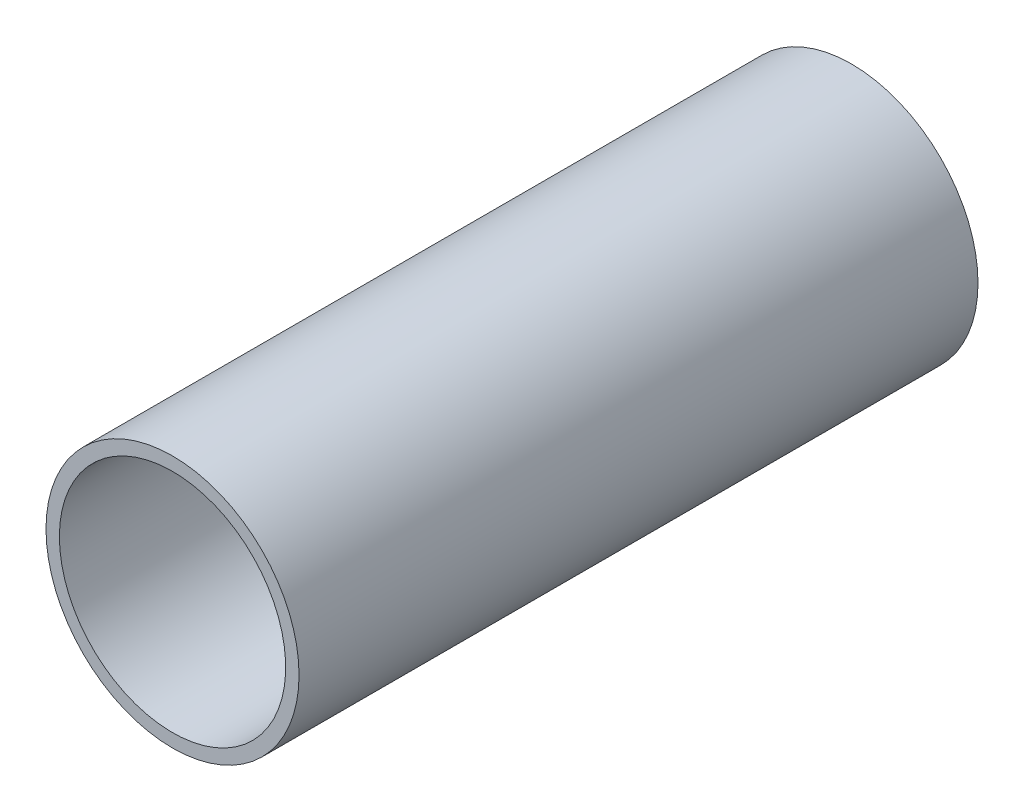
ISO-10303-21;
HEADER;
FILE_DESCRIPTION(('STEP AP214'),'2;1');
FILE_NAME('part.step','',(''),(''),'','','');
FILE_SCHEMA(('AUTOMOTIVE_DESIGN { 1 0 10303 214 1 1 1 1 }'));
ENDSEC;
DATA;
#1=APPLICATION_CONTEXT('core data for automotive mechanical design processes');
#2=APPLICATION_PROTOCOL_DEFINITION('international standard','automotive_design',2000,#1);
#3=PRODUCT_CONTEXT('',#1,'mechanical');
#4=PRODUCT('Part','Part','',(#3));
#5=PRODUCT_RELATED_PRODUCT_CATEGORY('part','',(#4));
#6=PRODUCT_DEFINITION_FORMATION('','',#4);
#7=PRODUCT_DEFINITION_CONTEXT('part definition',#1,'design');
#8=PRODUCT_DEFINITION('design','',#6,#7);
#9=PRODUCT_DEFINITION_SHAPE('','',#8);
#10=(LENGTH_UNIT() NAMED_UNIT(*) SI_UNIT(.MILLI.,.METRE.));
#11=(NAMED_UNIT(*) PLANE_ANGLE_UNIT() SI_UNIT($,.RADIAN.));
#12=(NAMED_UNIT(*) SI_UNIT($,.STERADIAN.) SOLID_ANGLE_UNIT());
#13=UNCERTAINTY_MEASURE_WITH_UNIT(LENGTH_MEASURE(1.E-05),#10,'distance_accuracy_value','');
#14=(GEOMETRIC_REPRESENTATION_CONTEXT(3) GLOBAL_UNCERTAINTY_ASSIGNED_CONTEXT((#13)) GLOBAL_UNIT_ASSIGNED_CONTEXT((#10,
#11,#12)) REPRESENTATION_CONTEXT('',''));
#15=CARTESIAN_POINT('',(0.,0.,0.));
#16=DIRECTION('',(0.,0.,1.));
#17=DIRECTION('',(1.,0.,0.));
#18=AXIS2_PLACEMENT_3D('',#15,#16,#17);
#19=CARTESIAN_POINT('',(0.,0.,152.4));
#20=DIRECTION('',(0.,0.,1.));
#21=DIRECTION('',(1.,0.,0.));
#22=AXIS2_PLACEMENT_3D('',#19,#20,#21);
#23=PLANE('',#22);
#24=CARTESIAN_POINT('',(0.,0.,152.4));
#25=DIRECTION('',(0.,0.,1.));
#26=DIRECTION('',(1.,0.,0.));
#27=AXIS2_PLACEMENT_3D('',#24,#25,#26);
#28=CIRCLE('',#27,28.4);
#29=CARTESIAN_POINT('',(-28.4,0.,152.4));
#30=VERTEX_POINT('',#29);
#31=EDGE_CURVE('E10',#30,#30,#28,.T.);
#32=ORIENTED_EDGE('',*,*,#31,.T.);
#33=EDGE_LOOP('',(#32));
#34=FACE_BOUND('',#33,.T.);
#35=CARTESIAN_POINT('',(0.,0.,152.4));
#36=DIRECTION('',(0.,0.,1.));
#37=DIRECTION('',(1.,0.,0.));
#38=AXIS2_PLACEMENT_3D('',#35,#36,#37);
#39=CIRCLE('',#38,25.4);
#40=CARTESIAN_POINT('',(-25.4,0.,152.4));
#41=VERTEX_POINT('',#40);
#42=EDGE_CURVE('E44',#41,#41,#39,.T.);
#43=ORIENTED_EDGE('',*,*,#42,.F.);
#44=EDGE_LOOP('',(#43));
#45=FACE_BOUND('',#44,.T.);
#46=ADVANCED_FACE('F33',(#34,#45),#23,.T.);
#47=CARTESIAN_POINT('',(0.,0.,0.));
#48=DIRECTION('',(0.,0.,1.));
#49=DIRECTION('',(1.,0.,0.));
#50=AXIS2_PLACEMENT_3D('',#47,#48,#49);
#51=PLANE('',#50);
#52=CARTESIAN_POINT('',(0.,0.,0.));
#53=DIRECTION('',(0.,0.,1.));
#54=DIRECTION('',(1.,0.,0.));
#55=AXIS2_PLACEMENT_3D('',#52,#53,#54);
#56=CIRCLE('',#55,28.4);
#57=CARTESIAN_POINT('',(-28.4,0.,0.));
#58=VERTEX_POINT('',#57);
#59=EDGE_CURVE('E37',#58,#58,#56,.T.);
#60=ORIENTED_EDGE('',*,*,#59,.F.);
#61=EDGE_LOOP('',(#60));
#62=FACE_BOUND('',#61,.T.);
#63=CARTESIAN_POINT('',(0.,0.,0.));
#64=DIRECTION('',(0.,0.,1.));
#65=DIRECTION('',(1.,0.,0.));
#66=AXIS2_PLACEMENT_3D('',#63,#64,#65);
#67=CIRCLE('',#66,25.4);
#68=CARTESIAN_POINT('',(-25.4,0.,0.));
#69=VERTEX_POINT('',#68);
#70=EDGE_CURVE('E46',#69,#69,#67,.T.);
#71=ORIENTED_EDGE('',*,*,#70,.T.);
#72=EDGE_LOOP('',(#71));
#73=FACE_BOUND('',#72,.T.);
#74=ADVANCED_FACE('F56',(#62,#73),#51,.F.);
#75=CARTESIAN_POINT('',(0.,0.,152.4));
#76=DIRECTION('',(0.,0.,-1.));
#77=DIRECTION('',(-1.,0.,0.));
#78=AXIS2_PLACEMENT_3D('',#75,#76,#77);
#79=CYLINDRICAL_SURFACE('',#78,28.4);
#80=CARTESIAN_POINT('',(-28.4,0.,152.4));
#81=CARTESIAN_POINT('',(-28.4,0.,150.8125));
#82=CARTESIAN_POINT('',(-28.4,0.,149.225));
#83=CARTESIAN_POINT('',(-28.4,0.,146.05));
#84=CARTESIAN_POINT('',(-28.4,0.,144.4625));
#85=CARTESIAN_POINT('',(-28.4,0.,141.2875));
#86=CARTESIAN_POINT('',(-28.4,0.,139.7));
#87=CARTESIAN_POINT('',(-28.4,0.,136.525));
#88=CARTESIAN_POINT('',(-28.4,0.,134.9375));
#89=CARTESIAN_POINT('',(-28.4,0.,131.7625));
#90=CARTESIAN_POINT('',(-28.4,0.,130.175));
#91=CARTESIAN_POINT('',(-28.4,0.,127.));
#92=CARTESIAN_POINT('',(-28.4,0.,125.4125));
#93=CARTESIAN_POINT('',(-28.4,0.,122.2375));
#94=CARTESIAN_POINT('',(-28.4,0.,120.65));
#95=CARTESIAN_POINT('',(-28.4,0.,117.475));
#96=CARTESIAN_POINT('',(-28.4,0.,115.8875));
#97=CARTESIAN_POINT('',(-28.4,0.,112.7125));
#98=CARTESIAN_POINT('',(-28.4,0.,111.125));
#99=CARTESIAN_POINT('',(-28.4,0.,107.95));
#100=CARTESIAN_POINT('',(-28.4,0.,106.3625));
#101=CARTESIAN_POINT('',(-28.4,0.,103.1875));
#102=CARTESIAN_POINT('',(-28.4,0.,101.6));
#103=CARTESIAN_POINT('',(-28.4,0.,98.425));
#104=CARTESIAN_POINT('',(-28.4,0.,96.8375));
#105=CARTESIAN_POINT('',(-28.4,0.,93.6625));
#106=CARTESIAN_POINT('',(-28.4,0.,92.075));
#107=CARTESIAN_POINT('',(-28.4,0.,88.9));
#108=CARTESIAN_POINT('',(-28.4,0.,87.3125));
#109=CARTESIAN_POINT('',(-28.4,0.,84.1375));
#110=CARTESIAN_POINT('',(-28.4,0.,82.55));
#111=CARTESIAN_POINT('',(-28.4,0.,79.375));
#112=CARTESIAN_POINT('',(-28.4,0.,77.7875));
#113=CARTESIAN_POINT('',(-28.4,0.,74.6125));
#114=CARTESIAN_POINT('',(-28.4,0.,73.025));
#115=CARTESIAN_POINT('',(-28.4,0.,69.85));
#116=CARTESIAN_POINT('',(-28.4,0.,68.2625));
#117=CARTESIAN_POINT('',(-28.4,0.,65.0875));
#118=CARTESIAN_POINT('',(-28.4,0.,63.5));
#119=CARTESIAN_POINT('',(-28.4,0.,60.325));
#120=CARTESIAN_POINT('',(-28.4,0.,58.7375));
#121=CARTESIAN_POINT('',(-28.4,0.,55.5625));
#122=CARTESIAN_POINT('',(-28.4,0.,53.975));
#123=CARTESIAN_POINT('',(-28.4,0.,50.8));
#124=CARTESIAN_POINT('',(-28.4,0.,49.2125));
#125=CARTESIAN_POINT('',(-28.4,0.,46.0375));
#126=CARTESIAN_POINT('',(-28.4,0.,44.45));
#127=CARTESIAN_POINT('',(-28.4,0.,41.275));
#128=CARTESIAN_POINT('',(-28.4,0.,39.6875));
#129=CARTESIAN_POINT('',(-28.4,0.,36.5125));
#130=CARTESIAN_POINT('',(-28.4,0.,34.925));
#131=CARTESIAN_POINT('',(-28.4,0.,31.75));
#132=CARTESIAN_POINT('',(-28.4,0.,30.1625));
#133=CARTESIAN_POINT('',(-28.4,0.,26.9875));
#134=CARTESIAN_POINT('',(-28.4,0.,25.4));
#135=CARTESIAN_POINT('',(-28.4,0.,22.225));
#136=CARTESIAN_POINT('',(-28.4,0.,20.6375));
#137=CARTESIAN_POINT('',(-28.4,0.,17.4625));
#138=CARTESIAN_POINT('',(-28.4,0.,15.875));
#139=CARTESIAN_POINT('',(-28.4,0.,12.7));
#140=CARTESIAN_POINT('',(-28.4,0.,11.1125));
#141=CARTESIAN_POINT('',(-28.4,0.,7.93750000000001));
#142=CARTESIAN_POINT('',(-28.4,0.,6.35));
#143=CARTESIAN_POINT('',(-28.4,0.,3.175));
#144=CARTESIAN_POINT('',(-28.4,0.,1.5875));
#145=CARTESIAN_POINT('',(-28.4,0.,0.));
#146=B_SPLINE_CURVE_WITH_KNOTS('',3,(#80,#81,#82,#83,#84,#85,#86,#87,#88,#89,#90,#91,#92,#93,
#94,#95,#96,#97,#98,#99,#100,#101,#102,#103,#104,#105,#106,#107,#108,#109,#110,#111,#112,#113,
#114,#115,#116,#117,#118,#119,#120,#121,#122,#123,#124,#125,#126,#127,#128,#129,#130,#131,#132,
#133,#134,#135,#136,#137,#138,#139,#140,#141,#142,#143,#144,#145),.UNSPECIFIED.,.F.,.F.,(4,2,2,
2,2,2,2,2,2,2,2,2,2,2,2,2,2,2,2,2,2,2,2,2,2,2,2,2,2,2,2,2,4),(0.,4.7625,9.52500000000001,
14.2875,19.05,23.8125,28.575,33.3375,38.1,42.8625,47.625,52.3875,57.15,61.9125,66.675,71.4375,
76.2,80.9625,85.725,90.4875,95.25,100.0125,104.775,109.5375,114.3,119.0625,123.825,128.5875,
133.35,138.1125,142.875,147.6375,152.4),.UNSPECIFIED.);
#147=EDGE_CURVE('BSEAM35',#30,#58,#146,.T.);
#148=ORIENTED_EDGE('',*,*,#31,.F.);
#149=ORIENTED_EDGE('',*,*,#59,.T.);
#150=ORIENTED_EDGE('',*,*,#147,.T.);
#151=ORIENTED_EDGE('',*,*,#147,.F.);
#152=EDGE_LOOP('',(#148,#150,#149,#151));
#153=FACE_BOUND('',#152,.T.);
#154=ADVANCED_FACE('F35',(#153),#79,.T.);
#155=CARTESIAN_POINT('',(0.,0.,152.4));
#156=DIRECTION('',(0.,0.,-1.));
#157=DIRECTION('',(-1.,0.,0.));
#158=AXIS2_PLACEMENT_3D('',#155,#156,#157);
#159=CYLINDRICAL_SURFACE('',#158,25.4);
#160=CARTESIAN_POINT('',(-25.4,0.,152.4));
#161=CARTESIAN_POINT('',(-25.4,0.,150.8125));
#162=CARTESIAN_POINT('',(-25.4,0.,149.225));
#163=CARTESIAN_POINT('',(-25.4,0.,146.05));
#164=CARTESIAN_POINT('',(-25.4,0.,144.4625));
#165=CARTESIAN_POINT('',(-25.4,0.,141.2875));
#166=CARTESIAN_POINT('',(-25.4,0.,139.7));
#167=CARTESIAN_POINT('',(-25.4,0.,136.525));
#168=CARTESIAN_POINT('',(-25.4,0.,134.9375));
#169=CARTESIAN_POINT('',(-25.4,0.,131.7625));
#170=CARTESIAN_POINT('',(-25.4,0.,130.175));
#171=CARTESIAN_POINT('',(-25.4,0.,127.));
#172=CARTESIAN_POINT('',(-25.4,0.,125.4125));
#173=CARTESIAN_POINT('',(-25.4,0.,122.2375));
#174=CARTESIAN_POINT('',(-25.4,0.,120.65));
#175=CARTESIAN_POINT('',(-25.4,0.,117.475));
#176=CARTESIAN_POINT('',(-25.4,0.,115.8875));
#177=CARTESIAN_POINT('',(-25.4,0.,112.7125));
#178=CARTESIAN_POINT('',(-25.4,0.,111.125));
#179=CARTESIAN_POINT('',(-25.4,0.,107.95));
#180=CARTESIAN_POINT('',(-25.4,0.,106.3625));
#181=CARTESIAN_POINT('',(-25.4,0.,103.1875));
#182=CARTESIAN_POINT('',(-25.4,0.,101.6));
#183=CARTESIAN_POINT('',(-25.4,0.,98.425));
#184=CARTESIAN_POINT('',(-25.4,0.,96.8375));
#185=CARTESIAN_POINT('',(-25.4,0.,93.6625));
#186=CARTESIAN_POINT('',(-25.4,0.,92.075));
#187=CARTESIAN_POINT('',(-25.4,0.,88.9));
#188=CARTESIAN_POINT('',(-25.4,0.,87.3125));
#189=CARTESIAN_POINT('',(-25.4,0.,84.1375));
#190=CARTESIAN_POINT('',(-25.4,0.,82.55));
#191=CARTESIAN_POINT('',(-25.4,0.,79.375));
#192=CARTESIAN_POINT('',(-25.4,0.,77.7875));
#193=CARTESIAN_POINT('',(-25.4,0.,74.6125));
#194=CARTESIAN_POINT('',(-25.4,0.,73.025));
#195=CARTESIAN_POINT('',(-25.4,0.,69.85));
#196=CARTESIAN_POINT('',(-25.4,0.,68.2625));
#197=CARTESIAN_POINT('',(-25.4,0.,65.0875));
#198=CARTESIAN_POINT('',(-25.4,0.,63.5));
#199=CARTESIAN_POINT('',(-25.4,0.,60.325));
#200=CARTESIAN_POINT('',(-25.4,0.,58.7375));
#201=CARTESIAN_POINT('',(-25.4,0.,55.5625));
#202=CARTESIAN_POINT('',(-25.4,0.,53.975));
#203=CARTESIAN_POINT('',(-25.4,0.,50.8));
#204=CARTESIAN_POINT('',(-25.4,0.,49.2125));
#205=CARTESIAN_POINT('',(-25.4,0.,46.0375));
#206=CARTESIAN_POINT('',(-25.4,0.,44.45));
#207=CARTESIAN_POINT('',(-25.4,0.,41.275));
#208=CARTESIAN_POINT('',(-25.4,0.,39.6875));
#209=CARTESIAN_POINT('',(-25.4,0.,36.5125));
#210=CARTESIAN_POINT('',(-25.4,0.,34.925));
#211=CARTESIAN_POINT('',(-25.4,0.,31.75));
#212=CARTESIAN_POINT('',(-25.4,0.,30.1625));
#213=CARTESIAN_POINT('',(-25.4,0.,26.9875));
#214=CARTESIAN_POINT('',(-25.4,0.,25.4));
#215=CARTESIAN_POINT('',(-25.4,0.,22.225));
#216=CARTESIAN_POINT('',(-25.4,0.,20.6375));
#217=CARTESIAN_POINT('',(-25.4,0.,17.4625));
#218=CARTESIAN_POINT('',(-25.4,0.,15.875));
#219=CARTESIAN_POINT('',(-25.4,0.,12.7));
#220=CARTESIAN_POINT('',(-25.4,0.,11.1125));
#221=CARTESIAN_POINT('',(-25.4,0.,7.93750000000001));
#222=CARTESIAN_POINT('',(-25.4,0.,6.35));
#223=CARTESIAN_POINT('',(-25.4,0.,3.175));
#224=CARTESIAN_POINT('',(-25.4,0.,1.5875));
#225=CARTESIAN_POINT('',(-25.4,0.,0.));
#226=B_SPLINE_CURVE_WITH_KNOTS('',3,(#160,#161,#162,#163,#164,#165,#166,#167,#168,#169,#170,
#171,#172,#173,#174,#175,#176,#177,#178,#179,#180,#181,#182,#183,#184,#185,#186,#187,#188,#189,
#190,#191,#192,#193,#194,#195,#196,#197,#198,#199,#200,#201,#202,#203,#204,#205,#206,#207,#208,
#209,#210,#211,#212,#213,#214,#215,#216,#217,#218,#219,#220,#221,#222,#223,#224,#225),
.UNSPECIFIED.,.F.,.F.,(4,2,2,2,2,2,2,2,2,2,2,2,2,2,2,2,2,2,2,2,2,2,2,2,2,2,2,2,2,2,2,2,4),(0.,
4.76249999999998,9.52499999999998,14.2875,19.05,23.8125,28.575,33.3375,38.1,42.8625,47.625,
52.3875,57.15,61.9125,66.675,71.4375,76.2,80.9625,85.725,90.4875,95.25,100.0125,104.775,
109.5375,114.3,119.0625,123.825,128.5875,133.35,138.1125,142.875,147.6375,152.4),.UNSPECIFIED.);
#227=EDGE_CURVE('BSEAM52',#41,#69,#226,.T.);
#228=ORIENTED_EDGE('',*,*,#42,.T.);
#229=ORIENTED_EDGE('',*,*,#70,.F.);
#230=ORIENTED_EDGE('',*,*,#227,.T.);
#231=ORIENTED_EDGE('',*,*,#227,.F.);
#232=EDGE_LOOP('',(#228,#230,#229,#231));
#233=FACE_BOUND('',#232,.T.);
#234=ADVANCED_FACE('F52',(#233),#159,.F.);
#235=CLOSED_SHELL('',(#46,#74,#154,#234));
#236=MANIFOLD_SOLID_BREP('B2',#235);
#237=ADVANCED_BREP_SHAPE_REPRESENTATION('',(#18,#236),#14);
#238=SHAPE_DEFINITION_REPRESENTATION(#9,#237);
ENDSEC;
END-ISO-10303-21;
